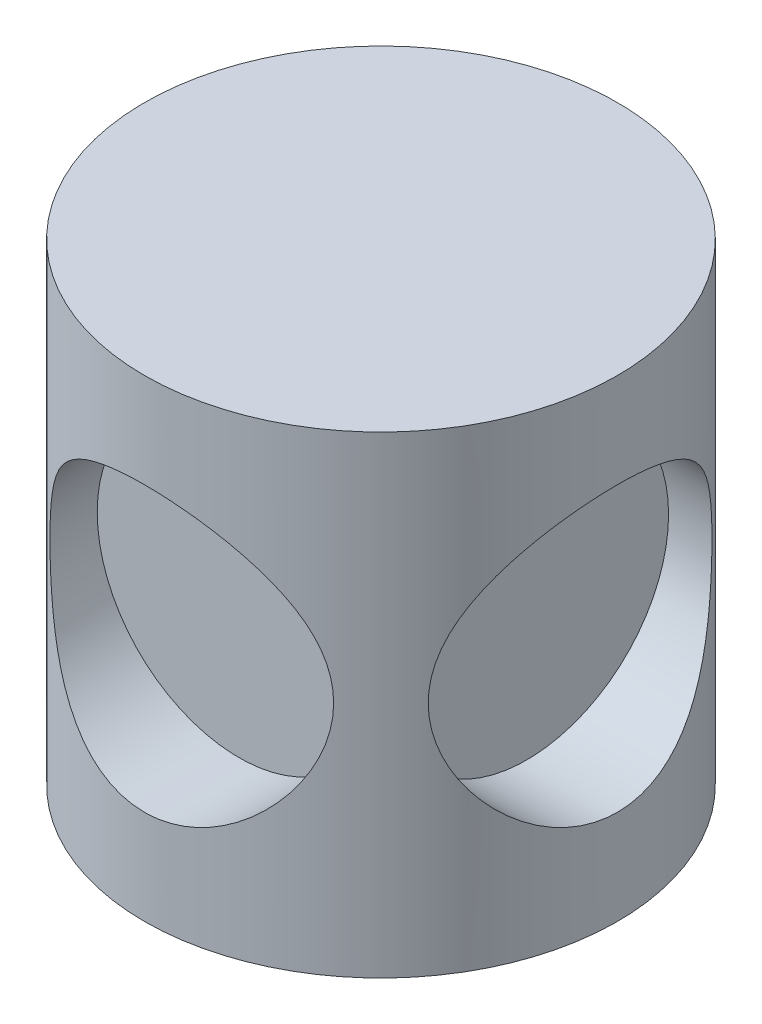
ISO-10303-21;
HEADER;
FILE_DESCRIPTION(('STEP AP214'),'2;1');
FILE_NAME('part.step','',(''),(''),'','','');
FILE_SCHEMA(('AUTOMOTIVE_DESIGN { 1 0 10303 214 1 1 1 1 }'));
ENDSEC;
DATA;
#1=APPLICATION_CONTEXT('core data for automotive mechanical design processes');
#2=APPLICATION_PROTOCOL_DEFINITION('international standard','automotive_design',2000,#1);
#3=PRODUCT_CONTEXT('',#1,'mechanical');
#4=PRODUCT('Part','Part','',(#3));
#5=PRODUCT_RELATED_PRODUCT_CATEGORY('part','',(#4));
#6=PRODUCT_DEFINITION_FORMATION('','',#4);
#7=PRODUCT_DEFINITION_CONTEXT('part definition',#1,'design');
#8=PRODUCT_DEFINITION('design','',#6,#7);
#9=PRODUCT_DEFINITION_SHAPE('','',#8);
#10=(LENGTH_UNIT() NAMED_UNIT(*) SI_UNIT(.MILLI.,.METRE.));
#11=(NAMED_UNIT(*) PLANE_ANGLE_UNIT() SI_UNIT($,.RADIAN.));
#12=(NAMED_UNIT(*) SI_UNIT($,.STERADIAN.) SOLID_ANGLE_UNIT());
#13=UNCERTAINTY_MEASURE_WITH_UNIT(LENGTH_MEASURE(1.E-05),#10,'distance_accuracy_value','');
#14=(GEOMETRIC_REPRESENTATION_CONTEXT(3) GLOBAL_UNCERTAINTY_ASSIGNED_CONTEXT((#13)) GLOBAL_UNIT_ASSIGNED_CONTEXT((#10,
#11,#12)) REPRESENTATION_CONTEXT('',''));
#15=CARTESIAN_POINT('',(0.,0.,0.));
#16=DIRECTION('',(0.,0.,1.));
#17=DIRECTION('',(1.,0.,0.));
#18=AXIS2_PLACEMENT_3D('',#15,#16,#17);
#19=CARTESIAN_POINT('',(0.,100.,0.));
#20=DIRECTION('',(0.,-1.,0.));
#21=DIRECTION('',(0.,0.,-1.));
#22=AXIS2_PLACEMENT_3D('',#19,#20,#21);
#23=CYLINDRICAL_SURFACE('',#22,50.);
#24=CARTESIAN_POINT('',(40.,50.,-30.));
#25=CARTESIAN_POINT('',(39.9999924355509,49.2452269205714,-30.0000054371733));
#26=CARTESIAN_POINT('',(40.0214403954393,48.4905107537716,-29.9714752342614));
#27=CARTESIAN_POINT('',(40.1062444493847,46.9877773538398,-29.8578998383123));
#28=CARTESIAN_POINT('',(40.1695977533699,46.2397596780805,-29.7728584078095));
#29=CARTESIAN_POINT('',(40.3355499097489,44.7558635400431,-29.5476372030003));
#30=CARTESIAN_POINT('',(40.438184622088,44.0199968125468,-29.4074070436577));
#31=CARTESIAN_POINT('',(40.6785728662393,42.5662659991316,-29.0739716563499));
#32=CARTESIAN_POINT('',(40.8163282339694,41.848402856498,-28.8807636589501));
#33=CARTESIAN_POINT('',(41.1208174466127,40.4401357541992,-28.445531905068));
#34=CARTESIAN_POINT('',(41.2873290187728,39.7495677502285,-28.2038804459786));
#35=CARTESIAN_POINT('',(41.644790948041,38.3932475691548,-27.6733374325039));
#36=CARTESIAN_POINT('',(41.8357445215649,37.7274986730078,-27.3844396594046));
#37=CARTESIAN_POINT('',(42.1364605134893,36.7494282923052,-26.9175218389558));
#38=CARTESIAN_POINT('',(42.2391003045645,36.4267728851495,-26.756254628249));
#39=CARTESIAN_POINT('',(42.4484734074239,35.7886065265011,-26.4228282782668));
#40=CARTESIAN_POINT('',(42.5552056486378,35.4730937404112,-26.2506719799854));
#41=CARTESIAN_POINT('',(42.8806472634173,34.5373990126269,-25.7181480386));
#42=CARTESIAN_POINT('',(43.1045955804228,33.9280798275437,-25.3417344973462));
#43=CARTESIAN_POINT('',(43.5893887462092,32.6675574927965,-24.4995757857681));
#44=CARTESIAN_POINT('',(43.8513964328546,32.0203453866913,-24.0285354757498));
#45=CARTESIAN_POINT('',(44.3801358051688,30.7667095395221,-23.0373408991427));
#46=CARTESIAN_POINT('',(44.6468677620499,30.1602881498321,-22.5171838053726));
#47=CARTESIAN_POINT('',(45.1790404761606,28.9900632476234,-21.4294452953907));
#48=CARTESIAN_POINT('',(45.4444801847927,28.426290231426,-20.8618305432127));
#49=CARTESIAN_POINT('',(45.9679876279243,27.3443160173169,-19.681488615426));
#50=CARTESIAN_POINT('',(46.2260549858159,26.8261171447056,-19.0687591408844));
#51=CARTESIAN_POINT('',(46.7564021460829,25.7846492026158,-17.7316223686081));
#52=CARTESIAN_POINT('',(47.0271973104288,25.2669012200967,-17.0023054886216));
#53=CARTESIAN_POINT('',(47.5453815754836,24.2952887845265,-15.4942685286804));
#54=CARTESIAN_POINT('',(47.7927685483637,23.841430137257,-14.715543968244));
#55=CARTESIAN_POINT('',(48.2568802958075,23.0028077748891,-13.1136665383535));
#56=CARTESIAN_POINT('',(48.4736264229592,22.6179958925397,-12.2905451657093));
#57=CARTESIAN_POINT('',(48.870041879193,21.9222010200527,-10.6050928823802));
#58=CARTESIAN_POINT('',(49.0497173006521,21.6112058972501,-9.74276844298749));
#59=CARTESIAN_POINT('',(49.3510766635053,21.0937968047369,-8.06989441005333));
#60=CARTESIAN_POINT('',(49.4766580911894,20.8802355341535,-7.26225533212927));
#61=CARTESIAN_POINT('',(49.6891894498777,20.5205723337827,-5.62706899055213));
#62=CARTESIAN_POINT('',(49.7761416205889,20.3744664929405,-4.79952288403311));
#63=CARTESIAN_POINT('',(49.9087796773502,20.1521484161146,-3.13246717024253));
#64=CARTESIAN_POINT('',(49.9544978737898,20.075881454603,-2.29296745458034));
#65=CARTESIAN_POINT('',(50.0033768126454,19.9943537217449,-0.609322714269915));
#66=CARTESIAN_POINT('',(50.0065418849347,19.9890857260986,0.234821829012516));
#67=CARTESIAN_POINT('',(49.9725033434349,20.04584499981,1.81489529981786));
#68=CARTESIAN_POINT('',(49.9402633154867,20.0995977628538,2.55124667795299));
#69=CARTESIAN_POINT('',(49.8438693758083,20.260875604647,4.01585794086052));
#70=CARTESIAN_POINT('',(49.7797187521093,20.3683951433353,4.74411865138387));
#71=CARTESIAN_POINT('',(49.620977165127,20.6358562914649,6.18756243161352));
#72=CARTESIAN_POINT('',(49.5263851106974,20.79579978,6.90274503157525));
#73=CARTESIAN_POINT('',(49.3088598139461,21.1662329975663,8.31547959196036));
#74=CARTESIAN_POINT('',(49.1859254038559,21.3767248093163,9.01303082461759));
#75=CARTESIAN_POINT('',(48.9135476146462,21.8473418423832,10.3904072750655));
#76=CARTESIAN_POINT('',(48.7639571594241,22.1077430771586,11.0701088227145));
#77=CARTESIAN_POINT('',(48.441789827711,22.6748932830673,12.4041910107697));
#78=CARTESIAN_POINT('',(48.2692131671293,22.9816418188642,13.0585718889383));
#79=CARTESIAN_POINT('',(47.9043659781244,23.6389864593606,14.3392870539587));
#80=CARTESIAN_POINT('',(47.7120927225473,23.9895886374434,14.9656174396905));
#81=CARTESIAN_POINT('',(47.3113861831583,24.7321358129417,16.1878487666349));
#82=CARTESIAN_POINT('',(47.1029518864841,25.1240834021578,16.783747796732));
#83=CARTESIAN_POINT('',(46.6479274519125,25.9961748777138,18.0124884902317));
#84=CARTESIAN_POINT('',(46.3997536842666,26.4812613466894,18.6412397419404));
#85=CARTESIAN_POINT('',(45.8930644751573,27.497392695038,19.8559772510624));
#86=CARTESIAN_POINT('',(45.6345483218784,28.0284407406571,20.4419605571017));
#87=CARTESIAN_POINT('',(45.1123778800076,29.1346054050201,21.569887598821));
#88=CARTESIAN_POINT('',(44.8487174528413,29.7097774213712,22.1117741531459));
#89=CARTESIAN_POINT('',(44.3223864406096,30.9013184357979,23.1487409834838));
#90=CARTESIAN_POINT('',(44.0597159018081,31.5176893347382,23.6438190972658));
#91=CARTESIAN_POINT('',(43.5114023855333,32.8634207937001,24.6397506704863));
#92=CARTESIAN_POINT('',(43.2266309181986,33.5975928295455,25.134607075518));
#93=CARTESIAN_POINT('',(42.6750161739419,35.1119457957829,26.060187845091));
#94=CARTESIAN_POINT('',(42.4081758489753,35.892134262231,26.4909016641373));
#95=CARTESIAN_POINT('',(41.9025771259453,37.4939019430046,27.2835991057643));
#96=CARTESIAN_POINT('',(41.663776855557,38.3154167548256,27.6456857193192));
#97=CARTESIAN_POINT('',(41.2239700066492,39.9963703040386,28.2973336841537));
#98=CARTESIAN_POINT('',(41.0229485892923,40.855793987062,28.586923525734));
#99=CARTESIAN_POINT('',(40.7124607158075,42.3894456048256,29.0266922229524));
#100=CARTESIAN_POINT('',(40.5926498926779,43.0568142545907,29.1936352760004));
#101=CARTESIAN_POINT('',(40.3837646228614,44.406052584421,29.4819157838905));
#102=CARTESIAN_POINT('',(40.2946852685501,45.0879199306537,29.6032605207762));
#103=CARTESIAN_POINT('',(40.1504262123343,46.4612835515443,29.7986252970483));
#104=CARTESIAN_POINT('',(40.0952129290315,47.152769590081,29.8726922198134));
#105=CARTESIAN_POINT('',(40.0205909917451,48.5411837680627,29.9725913229736));
#106=CARTESIAN_POINT('',(40.0011830970955,49.2381120226074,29.9984224804208));
#107=CARTESIAN_POINT('',(39.9989205730711,50.6330929695621,30.001439292512));
#108=CARTESIAN_POINT('',(40.016116263115,51.3311458899681,29.9785579814936));
#109=CARTESIAN_POINT('',(40.0864993514701,52.722127866568,29.8843768935634));
#110=CARTESIAN_POINT('',(40.1396869372494,53.4150568960544,29.8130768644567));
#111=CARTESIAN_POINT('',(40.2801155116223,54.7913202770706,29.6230684849219));
#112=CARTESIAN_POINT('',(40.3673793756117,55.4746478632511,29.5043282866804));
#113=CARTESIAN_POINT('',(40.5729035284754,56.8269535186389,29.2210546703214));
#114=CARTESIAN_POINT('',(40.6911646881071,57.4959311841654,29.0565199657639));
#115=CARTESIAN_POINT('',(40.9546817127304,58.8149313038834,28.6838971255832));
#116=CARTESIAN_POINT('',(41.099893970628,59.4649824431176,28.4758792783311));
#117=CARTESIAN_POINT('',(41.4133350881076,60.7447421919884,28.0180764187168));
#118=CARTESIAN_POINT('',(41.5815731918176,61.3744425052817,27.7682746224651));
#119=CARTESIAN_POINT('',(41.9367586997092,62.6112149171688,27.2288911048792));
#120=CARTESIAN_POINT('',(42.1237096452986,63.2182827026054,26.9393018498846));
#121=CARTESIAN_POINT('',(42.5119906697039,64.4078239321894,26.3223000055147));
#122=CARTESIAN_POINT('',(42.713317060781,64.9903036233565,25.9948971032765));
#123=CARTESIAN_POINT('',(43.1636078905243,66.2323716245478,25.2414085206862));
#124=CARTESIAN_POINT('',(43.4146109863377,66.8868967379913,24.8081780488878));
#125=CARTESIAN_POINT('',(43.9246536038002,68.1580335537829,23.8934940052003));
#126=CARTESIAN_POINT('',(44.1836938512659,68.7746418168658,23.4120360691994));
#127=CARTESIAN_POINT('',(44.7040326920285,69.9684598947072,22.4025038732756));
#128=CARTESIAN_POINT('',(44.9653330646558,70.5456347277241,21.8743891519663));
#129=CARTESIAN_POINT('',(45.4842796758364,71.6578301169655,20.7737943393439));
#130=CARTESIAN_POINT('',(45.7419257245319,72.1928484895118,20.2013119528565));
#131=CARTESIAN_POINT('',(46.2811171660542,73.2851001855273,18.9364779766343));
#132=CARTESIAN_POINT('',(46.5614043507672,73.8361500707667,18.2382257014388));
#133=CARTESIAN_POINT('',(47.1028396436449,74.8772013130106,16.7904682073809));
#134=CARTESIAN_POINT('',(47.3639857916585,75.367196421245,16.0409577545394));
#135=CARTESIAN_POINT('',(47.8597679650153,76.2812622145009,14.4948690885772));
#136=CARTESIAN_POINT('',(48.0944166466547,76.7053644094267,13.6983136253921));
#137=CARTESIAN_POINT('',(48.5304710877414,77.4829085808844,12.0627242110709));
#138=CARTESIAN_POINT('',(48.731881378668,77.8363601907911,11.223696070764));
#139=CARTESIAN_POINT('',(49.0820154369011,78.4447091895007,9.57163089673219));
#140=CARTESIAN_POINT('',(49.2335028420042,78.7048990218314,8.76112996669414));
#141=CARTESIAN_POINT('',(49.4981910314828,79.1565507968783,7.11503534150898));
#142=CARTESIAN_POINT('',(49.6113932400335,79.3480152961319,6.27944258101491));
#143=CARTESIAN_POINT('',(49.7959943798632,79.6590072808808,4.59121918613498));
#144=CARTESIAN_POINT('',(49.8674326814406,79.7786025195841,3.73860538410504));
#145=CARTESIAN_POINT('',(49.9664050743556,79.9440494730322,2.02375863082274));
#146=CARTESIAN_POINT('',(49.9939448890237,79.989910800952,1.16152694827899));
#147=CARTESIAN_POINT('',(50.0035796163062,80.0059636845279,-0.448638369596412));
#148=CARTESIAN_POINT('',(49.9912497430118,79.9854383726646,-1.19646649879254));
#149=CARTESIAN_POINT('',(49.9333091422452,79.8887419424398,-2.68715701856049));
#150=CARTESIAN_POINT('',(49.8877020198906,79.8125768518574,-3.43001993824534));
#151=CARTESIAN_POINT('',(49.7643009048837,79.6056163790939,-4.90534527411012));
#152=CARTESIAN_POINT('',(49.6865071367958,79.4748213780623,-5.63780776281635));
#153=CARTESIAN_POINT('',(49.5005437474305,79.160245460038,-7.08732236988177));
#154=CARTESIAN_POINT('',(49.3923732157727,78.9764629550249,-7.80437402569052));
#155=CARTESIAN_POINT('',(49.1500473875609,78.5614260115334,-9.20713596965783));
#156=CARTESIAN_POINT('',(49.0163393490528,78.3309850756384,-9.89316522831641));
#157=CARTESIAN_POINT('',(48.7246154429874,77.8232155122072,-11.242249514208));
#158=CARTESIAN_POINT('',(48.5666001756052,77.5458880423398,-11.9053051081935));
#159=CARTESIAN_POINT('',(48.2293178600434,76.946769704929,-13.2054545723106));
#160=CARTESIAN_POINT('',(48.0500484828003,76.6249739638318,-13.8425455868989));
#161=CARTESIAN_POINT('',(47.6735789595605,75.9393946780804,-15.0881846024373));
#162=CARTESIAN_POINT('',(47.4763776858225,75.5756084922492,-15.6967308045441));
#163=CARTESIAN_POINT('',(47.0453184951055,74.7667424868672,-16.9476190424841));
#164=CARTESIAN_POINT('',(46.8098051726833,74.317124761882,-17.5864585689584));
#165=CARTESIAN_POINT('',(46.325936934833,73.3721450786188,-18.8241654588664));
#166=CARTESIAN_POINT('',(46.0775812628445,72.876780423972,-19.4230304625739));
#167=CARTESIAN_POINT('',(45.5728772295248,71.8424161446594,-20.5793876993337));
#168=CARTESIAN_POINT('',(45.3165210670254,71.3033730570058,-21.1368376378641));
#169=CARTESIAN_POINT('',(44.8013865884645,70.1844237054672,-22.2078589213947));
#170=CARTESIAN_POINT('',(44.5426081325414,69.6045150692523,-22.7214277151681));
#171=CARTESIAN_POINT('',(43.9954895932492,68.3296315731871,-23.7652386100365));
#172=CARTESIAN_POINT('',(43.7075675480209,67.6293953373685,-24.2893195038195));
#173=CARTESIAN_POINT('',(43.2851540783708,66.5443485377289,-25.0295083694434));
#174=CARTESIAN_POINT('',(43.1459165421275,66.1768518277079,-25.2686007562634));
#175=CARTESIAN_POINT('',(42.8716442524079,65.4304379178484,-25.731195664513));
#176=CARTESIAN_POINT('',(42.7366110683665,65.0515165547962,-25.9546924020116));
#177=CARTESIAN_POINT('',(42.3397557549876,63.8987545541486,-26.6007590168041));
#178=CARTESIAN_POINT('',(42.0859808338299,63.1084169941735,-26.999246247833));
#179=CARTESIAN_POINT('',(41.6097198076573,61.4877271374779,-27.7276182166737));
#180=CARTESIAN_POINT('',(41.3872256518336,60.6573852109229,-28.0575206168377));
#181=CARTESIAN_POINT('',(41.0929389990196,59.4218729808165,-28.4850286249539));
#182=CARTESIAN_POINT('',(41.0048657325039,59.0303875847087,-28.6115719641199));
#183=CARTESIAN_POINT('',(40.8382373313778,58.2407883767876,-28.8489055913011));
#184=CARTESIAN_POINT('',(40.7596797970073,57.8426762650839,-28.9596998522838));
#185=CARTESIAN_POINT('',(40.5395886546573,56.6392269319267,-29.2678307379545));
#186=CARTESIAN_POINT('',(40.4135940279387,55.8246011945323,-29.440976404297));
#187=CARTESIAN_POINT('',(40.209493955114,54.179513868914,-29.7191257226127));
#188=CARTESIAN_POINT('',(40.1312994945307,53.349084703494,-29.8242560556143));
#189=CARTESIAN_POINT('',(40.0265599738779,51.6790794463647,-29.9646857763522));
#190=CARTESIAN_POINT('',(40.0000084136404,50.8395045191896,-29.9999939524452));
#191=CARTESIAN_POINT('',(40.,50.,-30.));
#192=B_SPLINE_CURVE_WITH_KNOTS('',3,(#24,#25,#26,#27,#28,#29,#30,#31,#32,#33,#34,#35,#36,#37,
#38,#39,#40,#41,#42,#43,#44,#45,#46,#47,#48,#49,#50,#51,#52,#53,#54,#55,#56,#57,#58,#59,#60,#61,
#62,#63,#64,#65,#66,#67,#68,#69,#70,#71,#72,#73,#74,#75,#76,#77,#78,#79,#80,#81,#82,#83,#84,#85,
#86,#87,#88,#89,#90,#91,#92,#93,#94,#95,#96,#97,#98,#99,#100,#101,#102,#103,#104,#105,#106,#107,
#108,#109,#110,#111,#112,#113,#114,#115,#116,#117,#118,#119,#120,#121,#122,#123,#124,#125,#126,
#127,#128,#129,#130,#131,#132,#133,#134,#135,#136,#137,#138,#139,#140,#141,#142,#143,#144,#145,
#146,#147,#148,#149,#150,#151,#152,#153,#154,#155,#156,#157,#158,#159,#160,#161,#162,#163,#164,
#165,#166,#167,#168,#169,#170,#171,#172,#173,#174,#175,#176,#177,#178,#179,#180,#181,#182,#183,
#184,#185,#186,#187,#188,#189,#190,#191),.UNSPECIFIED.,.T.,.F.,(4,2,2,2,2,2,2,2,2,2,2,2,2,2,2,2,
2,2,2,2,2,2,2,2,2,2,2,2,2,2,2,2,2,2,2,2,2,2,2,2,2,2,2,2,2,2,2,2,2,2,2,2,2,2,2,2,2,2,2,2,2,2,2,2,
2,2,2,2,2,2,2,2,2,2,2,2,2,2,2,2,2,2,2,4),(0.,2.26339065976523,4.52663063739906,6.79194167103309,
9.05737114715353,11.3060153718576,13.5549558090047,14.6798398054329,15.8044315174353,
18.053680844433,20.578006829107,23.1024782036475,25.6287380005962,28.1551266186055,
30.954941350871,33.7550103451903,36.553118342749,39.3507661189212,41.8814765390891,
44.4120402106454,46.9406192393127,49.4689409776018,51.683333411791,53.8974977247651,
56.1117414113421,58.3260763460167,60.5530302662239,62.7799632701391,65.0072050288865,
67.2345864887666,69.7280443332067,72.2216740863463,74.71848750613,77.2154162053875,
80.002108172649,82.7892577871951,85.5721909336379,88.3540287001651,90.4467811706651,
92.5391992867497,94.6295392047498,96.7199234526042,98.8131832342802,100.906453919041,
103.001132238211,105.095869406138,107.187246361405,109.279465412906,111.372081168463,
113.46416201983,115.933925800171,118.403913272112,120.876064180349,123.348343060374,
126.142642921312,128.937228535818,131.730473642596,134.523337623591,137.113418055671,
139.703402128459,142.290940703078,144.878141895905,147.120010063233,149.361635392023,
151.603245081396,153.844921958156,156.050442084091,158.25590776179,160.461615342147,
162.667461736035,165.112763633141,167.558209750834,170.006119860739,172.454172194157,
175.21302745175,176.592687183034,177.972855896356,180.731292892543,183.489018638118,
184.750877047949,186.012416565873,188.534926127152,191.052723792891,193.57020452896),.UNSPECIFIED.);
#193=CARTESIAN_POINT('',(40.,50.,-30.));
#194=VERTEX_POINT('',#193);
#195=EDGE_CURVE('E35',#194,#194,#192,.T.);
#196=ORIENTED_EDGE('',*,*,#195,.T.);
#197=EDGE_LOOP('',(#196));
#198=FACE_BOUND('',#197,.T.);
#199=CARTESIAN_POINT('',(30.,50.,40.));
#200=CARTESIAN_POINT('',(30.0000054371733,49.2452269205714,39.9999924355509));
#201=CARTESIAN_POINT('',(29.9714752342614,48.4905107537716,40.0214403954393));
#202=CARTESIAN_POINT('',(29.8578998383123,46.9877773538398,40.1062444493847));
#203=CARTESIAN_POINT('',(29.7728584078095,46.2397596780805,40.1695977533699));
#204=CARTESIAN_POINT('',(29.5476372030003,44.7558635400431,40.3355499097489));
#205=CARTESIAN_POINT('',(29.4074070436577,44.0199968125469,40.438184622088));
#206=CARTESIAN_POINT('',(29.0739716563499,42.5662659991316,40.6785728662393));
#207=CARTESIAN_POINT('',(28.8807636589501,41.848402856498,40.8163282339694));
#208=CARTESIAN_POINT('',(28.445531905068,40.4401357541992,41.1208174466127));
#209=CARTESIAN_POINT('',(28.2038804459786,39.7495677502285,41.2873290187728));
#210=CARTESIAN_POINT('',(27.6733374325039,38.3932475691548,41.644790948041));
#211=CARTESIAN_POINT('',(27.3844396594046,37.7274986730078,41.8357445215649));
#212=CARTESIAN_POINT('',(26.9175218389558,36.7494282923052,42.1364605134893));
#213=CARTESIAN_POINT('',(26.756254628249,36.4267728851495,42.2391003045645));
#214=CARTESIAN_POINT('',(26.4228282782668,35.7886065265011,42.4484734074239));
#215=CARTESIAN_POINT('',(26.2506719799854,35.4730937404112,42.5552056486378));
#216=CARTESIAN_POINT('',(25.7181480386,34.5373990126269,42.8806472634173));
#217=CARTESIAN_POINT('',(25.3417344973462,33.9280798275437,43.1045955804228));
#218=CARTESIAN_POINT('',(24.499575785768,32.6675574927965,43.5893887462092));
#219=CARTESIAN_POINT('',(24.0285354757498,32.0203453866913,43.8513964328545));
#220=CARTESIAN_POINT('',(23.0373408991427,30.7667095395221,44.3801358051688));
#221=CARTESIAN_POINT('',(22.5171838053726,30.1602881498321,44.6468677620499));
#222=CARTESIAN_POINT('',(21.4294452953907,28.9900632476234,45.1790404761606));
#223=CARTESIAN_POINT('',(20.8618305432127,28.426290231426,45.4444801847927));
#224=CARTESIAN_POINT('',(19.681488615426,27.3443160173169,45.9679876279243));
#225=CARTESIAN_POINT('',(19.0687591408844,26.8261171447056,46.2260549858159));
#226=CARTESIAN_POINT('',(17.7316223686081,25.7846492026158,46.7564021460829));
#227=CARTESIAN_POINT('',(17.0023054886216,25.2669012200967,47.0271973104288));
#228=CARTESIAN_POINT('',(15.4942685286804,24.2952887845265,47.5453815754836));
#229=CARTESIAN_POINT('',(14.715543968244,23.841430137257,47.7927685483637));
#230=CARTESIAN_POINT('',(13.1136665383535,23.0028077748891,48.2568802958075));
#231=CARTESIAN_POINT('',(12.2905451657092,22.6179958925397,48.4736264229592));
#232=CARTESIAN_POINT('',(10.6050928823802,21.9222010200527,48.870041879193));
#233=CARTESIAN_POINT('',(9.74276844298749,21.6112058972501,49.0497173006521));
#234=CARTESIAN_POINT('',(8.06989441005333,21.0937968047369,49.3510766635053));
#235=CARTESIAN_POINT('',(7.26225533212927,20.8802355341535,49.4766580911894));
#236=CARTESIAN_POINT('',(5.62706899055212,20.5205723337827,49.6891894498777));
#237=CARTESIAN_POINT('',(4.7995228840331,20.3744664929405,49.7761416205889));
#238=CARTESIAN_POINT('',(3.13246717024253,20.1521484161146,49.9087796773502));
#239=CARTESIAN_POINT('',(2.29296745458033,20.075881454603,49.9544978737898));
#240=CARTESIAN_POINT('',(0.609322714269915,19.9943537217449,50.0033768126454));
#241=CARTESIAN_POINT('',(-0.234821829012516,19.9890857260986,50.0065418849347));
#242=CARTESIAN_POINT('',(-1.81489529981786,20.04584499981,49.9725033434349));
#243=CARTESIAN_POINT('',(-2.55124667795299,20.0995977628538,49.9402633154867));
#244=CARTESIAN_POINT('',(-4.01585794086052,20.260875604647,49.8438693758083));
#245=CARTESIAN_POINT('',(-4.74411865138387,20.3683951433353,49.7797187521093));
#246=CARTESIAN_POINT('',(-6.18756243161353,20.6358562914649,49.620977165127));
#247=CARTESIAN_POINT('',(-6.90274503157526,20.79579978,49.5263851106974));
#248=CARTESIAN_POINT('',(-8.31547959196037,21.1662329975663,49.3088598139461));
#249=CARTESIAN_POINT('',(-9.0130308246176,21.3767248093163,49.1859254038559));
#250=CARTESIAN_POINT('',(-10.3904072750655,21.8473418423832,48.9135476146462));
#251=CARTESIAN_POINT('',(-11.0701088227145,22.1077430771586,48.7639571594241));
#252=CARTESIAN_POINT('',(-12.4041910107697,22.6748932830673,48.441789827711));
#253=CARTESIAN_POINT('',(-13.0585718889383,22.9816418188642,48.2692131671293));
#254=CARTESIAN_POINT('',(-14.3392870539587,23.6389864593606,47.9043659781244));
#255=CARTESIAN_POINT('',(-14.9656174396906,23.9895886374434,47.7120927225473));
#256=CARTESIAN_POINT('',(-16.1878487666349,24.7321358129417,47.3113861831583));
#257=CARTESIAN_POINT('',(-16.7837477967321,25.1240834021578,47.1029518864841));
#258=CARTESIAN_POINT('',(-18.0124884902317,25.9961748777138,46.6479274519125));
#259=CARTESIAN_POINT('',(-18.6412397419404,26.4812613466894,46.3997536842666));
#260=CARTESIAN_POINT('',(-19.8559772510624,27.497392695038,45.8930644751573));
#261=CARTESIAN_POINT('',(-20.4419605571017,28.0284407406571,45.6345483218784));
#262=CARTESIAN_POINT('',(-21.5698875988211,29.1346054050201,45.1123778800076));
#263=CARTESIAN_POINT('',(-22.1117741531459,29.7097774213712,44.8487174528413));
#264=CARTESIAN_POINT('',(-23.1487409834838,30.9013184357979,44.3223864406096));
#265=CARTESIAN_POINT('',(-23.6438190972658,31.5176893347382,44.0597159018081));
#266=CARTESIAN_POINT('',(-24.6397506704863,32.8634207937001,43.5114023855333));
#267=CARTESIAN_POINT('',(-25.134607075518,33.5975928295455,43.2266309181986));
#268=CARTESIAN_POINT('',(-26.060187845091,35.1119457957829,42.6750161739419));
#269=CARTESIAN_POINT('',(-26.4909016641373,35.892134262231,42.4081758489753));
#270=CARTESIAN_POINT('',(-27.2835991057643,37.4939019430046,41.9025771259453));
#271=CARTESIAN_POINT('',(-27.6456857193192,38.3154167548257,41.663776855557));
#272=CARTESIAN_POINT('',(-28.2973336841537,39.9963703040386,41.2239700066492));
#273=CARTESIAN_POINT('',(-28.586923525734,40.855793987062,41.0229485892923));
#274=CARTESIAN_POINT('',(-29.0266922229524,42.3894456048256,40.7124607158074));
#275=CARTESIAN_POINT('',(-29.1936352760004,43.0568142545907,40.5926498926779));
#276=CARTESIAN_POINT('',(-29.4819157838905,44.406052584421,40.3837646228614));
#277=CARTESIAN_POINT('',(-29.6032605207762,45.0879199306537,40.2946852685501));
#278=CARTESIAN_POINT('',(-29.7986252970483,46.4612835515443,40.1504262123343));
#279=CARTESIAN_POINT('',(-29.8726922198134,47.152769590081,40.0952129290315));
#280=CARTESIAN_POINT('',(-29.9725913229736,48.5411837680627,40.0205909917451));
#281=CARTESIAN_POINT('',(-29.9984224804208,49.2381120226074,40.0011830970955));
#282=CARTESIAN_POINT('',(-30.001439292512,50.6330929695621,39.9989205730711));
#283=CARTESIAN_POINT('',(-29.9785579814936,51.3311458899681,40.016116263115));
#284=CARTESIAN_POINT('',(-29.8843768935634,52.722127866568,40.0864993514701));
#285=CARTESIAN_POINT('',(-29.8130768644567,53.4150568960544,40.1396869372494));
#286=CARTESIAN_POINT('',(-29.6230684849219,54.7913202770706,40.2801155116223));
#287=CARTESIAN_POINT('',(-29.5043282866804,55.4746478632512,40.3673793756117));
#288=CARTESIAN_POINT('',(-29.2210546703214,56.8269535186389,40.5729035284754));
#289=CARTESIAN_POINT('',(-29.0565199657639,57.4959311841654,40.6911646881071));
#290=CARTESIAN_POINT('',(-28.6838971255832,58.8149313038834,40.9546817127304));
#291=CARTESIAN_POINT('',(-28.4758792783311,59.4649824431177,41.099893970628));
#292=CARTESIAN_POINT('',(-28.0180764187168,60.7447421919885,41.4133350881076));
#293=CARTESIAN_POINT('',(-27.7682746224651,61.3744425052817,41.5815731918176));
#294=CARTESIAN_POINT('',(-27.2288911048792,62.6112149171688,41.9367586997092));
#295=CARTESIAN_POINT('',(-26.9393018498846,63.2182827026054,42.1237096452986));
#296=CARTESIAN_POINT('',(-26.3223000055147,64.4078239321894,42.5119906697039));
#297=CARTESIAN_POINT('',(-25.9948971032765,64.9903036233565,42.713317060781));
#298=CARTESIAN_POINT('',(-25.2414085206861,66.2323716245478,43.1636078905243));
#299=CARTESIAN_POINT('',(-24.8081780488878,66.8868967379914,43.4146109863377));
#300=CARTESIAN_POINT('',(-23.8934940052002,68.1580335537829,43.9246536038002));
#301=CARTESIAN_POINT('',(-23.4120360691993,68.7746418168658,44.1836938512659));
#302=CARTESIAN_POINT('',(-22.4025038732755,69.9684598947072,44.7040326920285));
#303=CARTESIAN_POINT('',(-21.8743891519663,70.5456347277241,44.9653330646558));
#304=CARTESIAN_POINT('',(-20.7737943393439,71.6578301169655,45.4842796758364));
#305=CARTESIAN_POINT('',(-20.2013119528565,72.1928484895119,45.7419257245319));
#306=CARTESIAN_POINT('',(-18.9364779766343,73.2851001855274,46.2811171660542));
#307=CARTESIAN_POINT('',(-18.2382257014387,73.8361500707668,46.5614043507672));
#308=CARTESIAN_POINT('',(-16.7904682073809,74.8772013130106,47.1028396436449));
#309=CARTESIAN_POINT('',(-16.0409577545394,75.367196421245,47.3639857916585));
#310=CARTESIAN_POINT('',(-14.4948690885771,76.281262214501,47.8597679650153));
#311=CARTESIAN_POINT('',(-13.6983136253921,76.7053644094267,48.0944166466547));
#312=CARTESIAN_POINT('',(-12.0627242110709,77.4829085808844,48.5304710877414));
#313=CARTESIAN_POINT('',(-11.2236960707639,77.8363601907911,48.731881378668));
#314=CARTESIAN_POINT('',(-9.57163089673215,78.4447091895007,49.0820154369011));
#315=CARTESIAN_POINT('',(-8.76112996669411,78.7048990218314,49.2335028420043));
#316=CARTESIAN_POINT('',(-7.11503534150895,79.1565507968783,49.4981910314828));
#317=CARTESIAN_POINT('',(-6.27944258101489,79.3480152961319,49.6113932400335));
#318=CARTESIAN_POINT('',(-4.59121918613497,79.6590072808808,49.7959943798632));
#319=CARTESIAN_POINT('',(-3.73860538410504,79.7786025195841,49.8674326814405));
#320=CARTESIAN_POINT('',(-2.02375863082273,79.9440494730322,49.9664050743555));
#321=CARTESIAN_POINT('',(-1.16152694827898,79.989910800952,49.9939448890237));
#322=CARTESIAN_POINT('',(0.448638369596434,80.0059636845279,50.0035796163062));
#323=CARTESIAN_POINT('',(1.19646649879257,79.9854383726646,49.9912497430118));
#324=CARTESIAN_POINT('',(2.68715701856051,79.8887419424398,49.9333091422452));
#325=CARTESIAN_POINT('',(3.43001993824536,79.8125768518574,49.8877020198906));
#326=CARTESIAN_POINT('',(4.90534527411014,79.6056163790939,49.7643009048837));
#327=CARTESIAN_POINT('',(5.63780776281637,79.4748213780623,49.6865071367958));
#328=CARTESIAN_POINT('',(7.08732236988179,79.160245460038,49.5005437474305));
#329=CARTESIAN_POINT('',(7.80437402569053,78.9764629550249,49.3923732157727));
#330=CARTESIAN_POINT('',(9.20713596965784,78.5614260115334,49.1500473875609));
#331=CARTESIAN_POINT('',(9.89316522831643,78.3309850756384,49.0163393490528));
#332=CARTESIAN_POINT('',(11.242249514208,77.8232155122072,48.7246154429874));
#333=CARTESIAN_POINT('',(11.9053051081935,77.5458880423398,48.5666001756052));
#334=CARTESIAN_POINT('',(13.2054545723106,76.946769704929,48.2293178600434));
#335=CARTESIAN_POINT('',(13.8425455868989,76.6249739638318,48.0500484828003));
#336=CARTESIAN_POINT('',(15.0881846024373,75.9393946780803,47.6735789595604));
#337=CARTESIAN_POINT('',(15.6967308045441,75.5756084922492,47.4763776858225));
#338=CARTESIAN_POINT('',(16.9476190424841,74.7667424868672,47.0453184951055));
#339=CARTESIAN_POINT('',(17.5864585689585,74.317124761882,46.8098051726833));
#340=CARTESIAN_POINT('',(18.8241654588664,73.3721450786188,46.325936934833));
#341=CARTESIAN_POINT('',(19.4230304625739,72.876780423972,46.0775812628444));
#342=CARTESIAN_POINT('',(20.5793876993337,71.8424161446594,45.5728772295248));
#343=CARTESIAN_POINT('',(21.1368376378641,71.3033730570058,45.3165210670254));
#344=CARTESIAN_POINT('',(22.2078589213947,70.1844237054672,44.8013865884645));
#345=CARTESIAN_POINT('',(22.7214277151681,69.6045150692523,44.5426081325414));
#346=CARTESIAN_POINT('',(23.7652386100365,68.3296315731871,43.9954895932492));
#347=CARTESIAN_POINT('',(24.2893195038196,67.6293953373685,43.7075675480209));
#348=CARTESIAN_POINT('',(25.0295083694434,66.5443485377289,43.2851540783708));
#349=CARTESIAN_POINT('',(25.2686007562634,66.1768518277079,43.1459165421275));
#350=CARTESIAN_POINT('',(25.731195664513,65.4304379178484,42.8716442524079));
#351=CARTESIAN_POINT('',(25.9546924020116,65.0515165547962,42.7366110683665));
#352=CARTESIAN_POINT('',(26.6007590168042,63.8987545541486,42.3397557549876));
#353=CARTESIAN_POINT('',(26.999246247833,63.1084169941735,42.0859808338299));
#354=CARTESIAN_POINT('',(27.7276182166737,61.4877271374779,41.6097198076573));
#355=CARTESIAN_POINT('',(28.0575206168377,60.6573852109229,41.3872256518336));
#356=CARTESIAN_POINT('',(28.4850286249539,59.4218729808165,41.0929389990196));
#357=CARTESIAN_POINT('',(28.6115719641199,59.0303875847087,41.0048657325039));
#358=CARTESIAN_POINT('',(28.8489055913011,58.2407883767876,40.8382373313778));
#359=CARTESIAN_POINT('',(28.9596998522838,57.8426762650838,40.7596797970073));
#360=CARTESIAN_POINT('',(29.2678307379545,56.6392269319267,40.5395886546573));
#361=CARTESIAN_POINT('',(29.440976404297,55.8246011945323,40.4135940279387));
#362=CARTESIAN_POINT('',(29.7191257226127,54.179513868914,40.209493955114));
#363=CARTESIAN_POINT('',(29.8242560556143,53.349084703494,40.1312994945307));
#364=CARTESIAN_POINT('',(29.9646857763522,51.6790794463647,40.0265599738779));
#365=CARTESIAN_POINT('',(29.9999939524452,50.8395045191896,40.0000084136404));
#366=CARTESIAN_POINT('',(30.,50.,40.));
#367=B_SPLINE_CURVE_WITH_KNOTS('',3,(#199,#200,#201,#202,#203,#204,#205,#206,#207,#208,#209,
#210,#211,#212,#213,#214,#215,#216,#217,#218,#219,#220,#221,#222,#223,#224,#225,#226,#227,#228,
#229,#230,#231,#232,#233,#234,#235,#236,#237,#238,#239,#240,#241,#242,#243,#244,#245,#246,#247,
#248,#249,#250,#251,#252,#253,#254,#255,#256,#257,#258,#259,#260,#261,#262,#263,#264,#265,#266,
#267,#268,#269,#270,#271,#272,#273,#274,#275,#276,#277,#278,#279,#280,#281,#282,#283,#284,#285,
#286,#287,#288,#289,#290,#291,#292,#293,#294,#295,#296,#297,#298,#299,#300,#301,#302,#303,#304,
#305,#306,#307,#308,#309,#310,#311,#312,#313,#314,#315,#316,#317,#318,#319,#320,#321,#322,#323,
#324,#325,#326,#327,#328,#329,#330,#331,#332,#333,#334,#335,#336,#337,#338,#339,#340,#341,#342,
#343,#344,#345,#346,#347,#348,#349,#350,#351,#352,#353,#354,#355,#356,#357,#358,#359,#360,#361,
#362,#363,#364,#365,#366),.UNSPECIFIED.,.T.,.F.,(4,2,2,2,2,2,2,2,2,2,2,2,2,2,2,2,2,2,2,2,2,2,2,
2,2,2,2,2,2,2,2,2,2,2,2,2,2,2,2,2,2,2,2,2,2,2,2,2,2,2,2,2,2,2,2,2,2,2,2,2,2,2,2,2,2,2,2,2,2,2,2,
2,2,2,2,2,2,2,2,2,2,2,2,4),(0.,2.26339065976523,4.52663063739905,6.79194167103307,
9.05737114715353,11.3060153718576,13.5549558090047,14.6798398054329,15.8044315174353,
18.053680844433,20.578006829107,23.1024782036475,25.6287380005962,28.1551266186055,
30.954941350871,33.7550103451903,36.553118342749,39.3507661189212,41.8814765390891,
44.4120402106454,46.9406192393127,49.4689409776018,51.683333411791,53.8974977247652,
56.1117414113421,58.3260763460167,60.5530302662239,62.7799632701391,65.0072050288865,
67.2345864887666,69.7280443332067,72.2216740863463,74.71848750613,77.2154162053875,
80.002108172649,82.7892577871951,85.5721909336379,88.3540287001651,90.4467811706651,
92.5391992867497,94.6295392047497,96.7199234526042,98.8131832342802,100.906453919041,
103.001132238211,105.095869406138,107.187246361405,109.279465412906,111.372081168463,
113.46416201983,115.933925800171,118.403913272112,120.876064180349,123.348343060374,
126.142642921312,128.937228535818,131.730473642596,134.523337623591,137.113418055671,
139.703402128459,142.290940703078,144.878141895905,147.120010063233,149.361635392023,
151.603245081396,153.844921958156,156.050442084091,158.25590776179,160.461615342147,
162.667461736035,165.112763633141,167.558209750834,170.006119860739,172.454172194157,
175.21302745175,176.592687183034,177.972855896356,180.731292892543,183.489018638118,
184.750877047949,186.012416565873,188.534926127152,191.052723792891,193.57020452896),.UNSPECIFIED.);
#368=CARTESIAN_POINT('',(30.,50.,40.));
#369=VERTEX_POINT('',#368);
#370=EDGE_CURVE('E10',#369,#369,#367,.T.);
#371=ORIENTED_EDGE('',*,*,#370,.T.);
#372=EDGE_LOOP('',(#371));
#373=FACE_BOUND('',#372,.T.);
#374=CARTESIAN_POINT('',(0.,100.,0.));
#375=DIRECTION('',(0.,1.,0.));
#376=DIRECTION('',(0.,0.,1.));
#377=AXIS2_PLACEMENT_3D('',#374,#375,#376);
#378=CIRCLE('',#377,50.);
#379=CARTESIAN_POINT('',(0.,100.,50.));
#380=VERTEX_POINT('',#379);
#381=EDGE_CURVE('E42',#380,#380,#378,.T.);
#382=ORIENTED_EDGE('',*,*,#381,.F.);
#383=EDGE_LOOP('',(#382));
#384=FACE_BOUND('',#383,.T.);
#385=CARTESIAN_POINT('',(0.,0.,0.));
#386=DIRECTION('',(0.,1.,0.));
#387=DIRECTION('',(0.,0.,1.));
#388=AXIS2_PLACEMENT_3D('',#385,#386,#387);
#389=CIRCLE('',#388,50.);
#390=CARTESIAN_POINT('',(0.,0.,50.));
#391=VERTEX_POINT('',#390);
#392=EDGE_CURVE('E46',#391,#391,#389,.T.);
#393=ORIENTED_EDGE('',*,*,#392,.T.);
#394=EDGE_LOOP('',(#393));
#395=FACE_BOUND('',#394,.T.);
#396=ADVANCED_FACE('F31',(#198,#373,#384,#395),#23,.T.);
#397=CARTESIAN_POINT('',(0.,100.,0.));
#398=DIRECTION('',(0.,1.,0.));
#399=DIRECTION('',(0.,0.,1.));
#400=AXIS2_PLACEMENT_3D('',#397,#398,#399);
#401=PLANE('',#400);
#402=ORIENTED_EDGE('',*,*,#381,.T.);
#403=EDGE_LOOP('',(#402));
#404=FACE_BOUND('',#403,.T.);
#405=ADVANCED_FACE('F60',(#404),#401,.T.);
#406=CARTESIAN_POINT('',(0.,0.,0.));
#407=DIRECTION('',(0.,1.,0.));
#408=DIRECTION('',(0.,0.,1.));
#409=AXIS2_PLACEMENT_3D('',#406,#407,#408);
#410=PLANE('',#409);
#411=ORIENTED_EDGE('',*,*,#392,.F.);
#412=EDGE_LOOP('',(#411));
#413=FACE_BOUND('',#412,.T.);
#414=ADVANCED_FACE('F58',(#413),#410,.F.);
#415=CARTESIAN_POINT('',(0.,50.,30.));
#416=DIRECTION('',(0.,0.,1.));
#417=DIRECTION('',(1.,0.,0.));
#418=AXIS2_PLACEMENT_3D('',#415,#416,#417);
#419=CYLINDRICAL_SURFACE('',#418,30.);
#420=CARTESIAN_POINT('',(0.,50.,30.));
#421=DIRECTION('',(0.,0.,1.));
#422=DIRECTION('',(1.,0.,0.));
#423=AXIS2_PLACEMENT_3D('',#420,#421,#422);
#424=CIRCLE('',#423,30.);
#425=CARTESIAN_POINT('',(30.,50.,30.));
#426=VERTEX_POINT('',#425);
#427=EDGE_CURVE('E78',#426,#426,#424,.T.);
#428=ORIENTED_EDGE('',*,*,#427,.F.);
#429=EDGE_LOOP('',(#428));
#430=FACE_BOUND('',#429,.T.);
#431=ORIENTED_EDGE('',*,*,#370,.F.);
#432=EDGE_LOOP('',(#431));
#433=FACE_BOUND('',#432,.T.);
#434=ADVANCED_FACE('F52',(#430,#433),#419,.F.);
#435=CARTESIAN_POINT('',(0.,50.,30.));
#436=DIRECTION('',(0.,0.,1.));
#437=DIRECTION('',(1.,0.,0.));
#438=AXIS2_PLACEMENT_3D('',#435,#436,#437);
#439=PLANE('',#438);
#440=ORIENTED_EDGE('',*,*,#427,.T.);
#441=EDGE_LOOP('',(#440));
#442=FACE_BOUND('',#441,.T.);
#443=ADVANCED_FACE('F57',(#442),#439,.T.);
#444=CARTESIAN_POINT('',(30.8302916150785,50.,0.));
#445=DIRECTION('',(1.,0.,0.));
#446=DIRECTION('',(0.,0.,-1.));
#447=AXIS2_PLACEMENT_3D('',#444,#445,#446);
#448=CYLINDRICAL_SURFACE('',#447,30.);
#449=CARTESIAN_POINT('',(30.8302916150785,50.,0.));
#450=DIRECTION('',(1.,0.,0.));
#451=DIRECTION('',(0.,0.,-1.));
#452=AXIS2_PLACEMENT_3D('',#449,#450,#451);
#453=CIRCLE('',#452,30.);
#454=CARTESIAN_POINT('',(30.8302916150785,50.,-30.));
#455=VERTEX_POINT('',#454);
#456=EDGE_CURVE('E83',#455,#455,#453,.T.);
#457=ORIENTED_EDGE('',*,*,#456,.F.);
#458=EDGE_LOOP('',(#457));
#459=FACE_BOUND('',#458,.T.);
#460=ORIENTED_EDGE('',*,*,#195,.F.);
#461=EDGE_LOOP('',(#460));
#462=FACE_BOUND('',#461,.T.);
#463=ADVANCED_FACE('F90',(#459,#462),#448,.F.);
#464=CARTESIAN_POINT('',(30.8302916150785,50.,0.));
#465=DIRECTION('',(1.,0.,0.));
#466=DIRECTION('',(0.,0.,-1.));
#467=AXIS2_PLACEMENT_3D('',#464,#465,#466);
#468=PLANE('',#467);
#469=ORIENTED_EDGE('',*,*,#456,.T.);
#470=EDGE_LOOP('',(#469));
#471=FACE_BOUND('',#470,.T.);
#472=ADVANCED_FACE('F88',(#471),#468,.T.);
#473=CLOSED_SHELL('',(#396,#405,#414,#434,#443,#463,#472));
#474=MANIFOLD_SOLID_BREP('B2',#473);
#475=ADVANCED_BREP_SHAPE_REPRESENTATION('',(#18,#474),#14);
#476=SHAPE_DEFINITION_REPRESENTATION(#9,#475);
ENDSEC;
END-ISO-10303-21;
